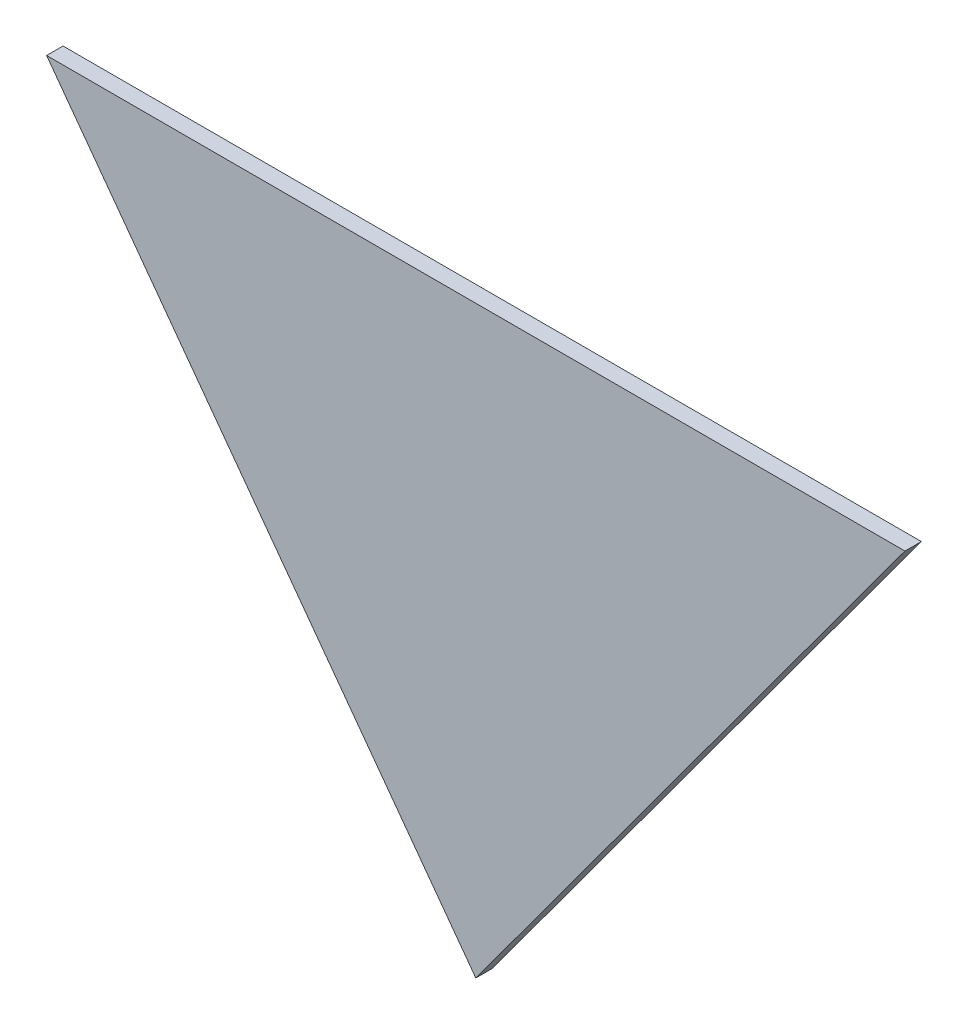
ISO-10303-21;
HEADER;
FILE_DESCRIPTION(('STEP AP214'),'2;1');
FILE_NAME('part.step','',(''),(''),'','','');
FILE_SCHEMA(('AUTOMOTIVE_DESIGN { 1 0 10303 214 1 1 1 1 }'));
ENDSEC;
DATA;
#1=APPLICATION_CONTEXT('core data for automotive mechanical design processes');
#2=APPLICATION_PROTOCOL_DEFINITION('international standard','automotive_design',2000,#1);
#3=PRODUCT_CONTEXT('',#1,'mechanical');
#4=PRODUCT('Part','Part','',(#3));
#5=PRODUCT_RELATED_PRODUCT_CATEGORY('part','',(#4));
#6=PRODUCT_DEFINITION_FORMATION('','',#4);
#7=PRODUCT_DEFINITION_CONTEXT('part definition',#1,'design');
#8=PRODUCT_DEFINITION('design','',#6,#7);
#9=PRODUCT_DEFINITION_SHAPE('','',#8);
#10=(LENGTH_UNIT() NAMED_UNIT(*) SI_UNIT(.MILLI.,.METRE.));
#11=(NAMED_UNIT(*) PLANE_ANGLE_UNIT() SI_UNIT($,.RADIAN.));
#12=(NAMED_UNIT(*) SI_UNIT($,.STERADIAN.) SOLID_ANGLE_UNIT());
#13=UNCERTAINTY_MEASURE_WITH_UNIT(LENGTH_MEASURE(1.E-05),#10,'distance_accuracy_value','');
#14=(GEOMETRIC_REPRESENTATION_CONTEXT(3) GLOBAL_UNCERTAINTY_ASSIGNED_CONTEXT((#13)) GLOBAL_UNIT_ASSIGNED_CONTEXT((#10,
#11,#12)) REPRESENTATION_CONTEXT('',''));
#15=CARTESIAN_POINT('',(0.,0.,0.));
#16=DIRECTION('',(0.,0.,1.));
#17=DIRECTION('',(1.,0.,0.));
#18=AXIS2_PLACEMENT_3D('',#15,#16,#17);
#19=CARTESIAN_POINT('',(0.,3.203541109986,0.09));
#20=DIRECTION('',(0.805970477030154,-0.591955733273854,0.));
#21=DIRECTION('',(0.591955733273854,0.805970477030154,0.));
#22=AXIS2_PLACEMENT_3D('',#19,#20,#21);
#23=PLANE('',#22);
#24=DIRECTION('',(0.591955733273854,0.805970477030154,0.));
#25=VECTOR('',#24,1.);
#26=CARTESIAN_POINT('',(0.,3.203541109986,0.09));
#27=LINE('',#26,#25);
#28=CARTESIAN_POINT('',(0.,3.203541109986,0.09));
#29=VERTEX_POINT('',#28);
#30=CARTESIAN_POINT('',(0.26143148482757,3.559490122206,0.09));
#31=VERTEX_POINT('',#30);
#32=EDGE_CURVE('E11',#29,#31,#27,.T.);
#33=ORIENTED_EDGE('',*,*,#32,.T.);
#34=DIRECTION('',(0.,0.,1.));
#35=VECTOR('',#34,1.);
#36=CARTESIAN_POINT('',(0.26143148482757,3.559490122206,0.09));
#37=LINE('',#36,#35);
#38=CARTESIAN_POINT('',(0.26143148482757,3.559490122206,0.1));
#39=VERTEX_POINT('',#38);
#40=EDGE_CURVE('E24',#31,#39,#37,.T.);
#41=ORIENTED_EDGE('',*,*,#40,.T.);
#42=DIRECTION('',(0.591955733273854,0.805970477030154,0.));
#43=VECTOR('',#42,1.);
#44=CARTESIAN_POINT('',(0.,3.203541109986,0.1));
#45=LINE('',#44,#43);
#46=CARTESIAN_POINT('',(0.,3.203541109986,0.1));
#47=VERTEX_POINT('',#46);
#48=EDGE_CURVE('E67',#47,#39,#45,.T.);
#49=ORIENTED_EDGE('',*,*,#48,.F.);
#50=DIRECTION('',(0.,0.,1.));
#51=VECTOR('',#50,1.);
#52=CARTESIAN_POINT('',(0.,3.203541109986,0.09));
#53=LINE('',#52,#51);
#54=EDGE_CURVE('E54',#29,#47,#53,.T.);
#55=ORIENTED_EDGE('',*,*,#54,.F.);
#56=EDGE_LOOP('',(#33,#41,#49,#55));
#57=FACE_BOUND('',#56,.T.);
#58=ADVANCED_FACE('F17',(#57),#23,.T.);
#59=CARTESIAN_POINT('',(-0.26143148482757,3.559490122206,0.09));
#60=DIRECTION('',(-0.805970477030154,-0.591955733273854,0.));
#61=DIRECTION('',(0.591955733273854,-0.805970477030154,0.));
#62=AXIS2_PLACEMENT_3D('',#59,#60,#61);
#63=PLANE('',#62);
#64=DIRECTION('',(0.591955733273854,-0.805970477030154,0.));
#65=VECTOR('',#64,1.);
#66=CARTESIAN_POINT('',(-0.26143148482757,3.559490122206,0.09));
#67=LINE('',#66,#65);
#68=CARTESIAN_POINT('',(-0.26143148482757,3.559490122206,0.09));
#69=VERTEX_POINT('',#68);
#70=EDGE_CURVE('E58',#69,#29,#67,.T.);
#71=ORIENTED_EDGE('',*,*,#70,.T.);
#72=ORIENTED_EDGE('',*,*,#54,.T.);
#73=DIRECTION('',(0.591955733273854,-0.805970477030154,0.));
#74=VECTOR('',#73,1.);
#75=CARTESIAN_POINT('',(-0.26143148482757,3.559490122206,0.1));
#76=LINE('',#75,#74);
#77=CARTESIAN_POINT('',(-0.26143148482757,3.559490122206,0.1));
#78=VERTEX_POINT('',#77);
#79=EDGE_CURVE('E48',#78,#47,#76,.T.);
#80=ORIENTED_EDGE('',*,*,#79,.F.);
#81=DIRECTION('',(0.,0.,1.));
#82=VECTOR('',#81,1.);
#83=CARTESIAN_POINT('',(-0.26143148482757,3.559490122206,0.09));
#84=LINE('',#83,#82);
#85=EDGE_CURVE('E52',#69,#78,#84,.T.);
#86=ORIENTED_EDGE('',*,*,#85,.F.);
#87=EDGE_LOOP('',(#71,#72,#80,#86));
#88=FACE_BOUND('',#87,.T.);
#89=ADVANCED_FACE('F51',(#88),#63,.T.);
#90=CARTESIAN_POINT('',(0.26143148482757,3.559490122206,0.09));
#91=DIRECTION('',(0.,1.,0.));
#92=DIRECTION('',(-1.,0.,0.));
#93=AXIS2_PLACEMENT_3D('',#90,#91,#92);
#94=PLANE('',#93);
#95=DIRECTION('',(-1.,0.,0.));
#96=VECTOR('',#95,1.);
#97=CARTESIAN_POINT('',(0.26143148482757,3.559490122206,0.09));
#98=LINE('',#97,#96);
#99=EDGE_CURVE('E64',#31,#69,#98,.T.);
#100=ORIENTED_EDGE('',*,*,#99,.T.);
#101=ORIENTED_EDGE('',*,*,#85,.T.);
#102=DIRECTION('',(-1.,0.,0.));
#103=VECTOR('',#102,1.);
#104=CARTESIAN_POINT('',(0.26143148482757,3.559490122206,0.1));
#105=LINE('',#104,#103);
#106=EDGE_CURVE('E63',#39,#78,#105,.T.);
#107=ORIENTED_EDGE('',*,*,#106,.F.);
#108=ORIENTED_EDGE('',*,*,#40,.F.);
#109=EDGE_LOOP('',(#100,#101,#107,#108));
#110=FACE_BOUND('',#109,.T.);
#111=ADVANCED_FACE('F62',(#110),#94,.T.);
#112=CARTESIAN_POINT('',(0.,3.447693982157,0.1));
#113=DIRECTION('',(0.,0.,1.));
#114=DIRECTION('',(1.,0.,0.));
#115=AXIS2_PLACEMENT_3D('',#112,#113,#114);
#116=PLANE('',#115);
#117=ORIENTED_EDGE('',*,*,#106,.T.);
#118=ORIENTED_EDGE('',*,*,#79,.T.);
#119=ORIENTED_EDGE('',*,*,#48,.T.);
#120=EDGE_LOOP('',(#117,#118,#119));
#121=FACE_BOUND('',#120,.T.);
#122=ADVANCED_FACE('F66',(#121),#116,.T.);
#123=CARTESIAN_POINT('',(0.,3.447693982157,0.09));
#124=DIRECTION('',(0.,0.,1.));
#125=DIRECTION('',(1.,0.,0.));
#126=AXIS2_PLACEMENT_3D('',#123,#124,#125);
#127=PLANE('',#126);
#128=ORIENTED_EDGE('',*,*,#99,.F.);
#129=ORIENTED_EDGE('',*,*,#32,.F.);
#130=ORIENTED_EDGE('',*,*,#70,.F.);
#131=EDGE_LOOP('',(#128,#129,#130));
#132=FACE_BOUND('',#131,.T.);
#133=ADVANCED_FACE('F73',(#132),#127,.F.);
#134=CLOSED_SHELL('',(#58,#89,#111,#122,#133));
#135=MANIFOLD_SOLID_BREP('B1',#134);
#136=ADVANCED_BREP_SHAPE_REPRESENTATION('',(#18,#135),#14);
#137=SHAPE_DEFINITION_REPRESENTATION(#9,#136);
ENDSEC;
END-ISO-10303-21;
